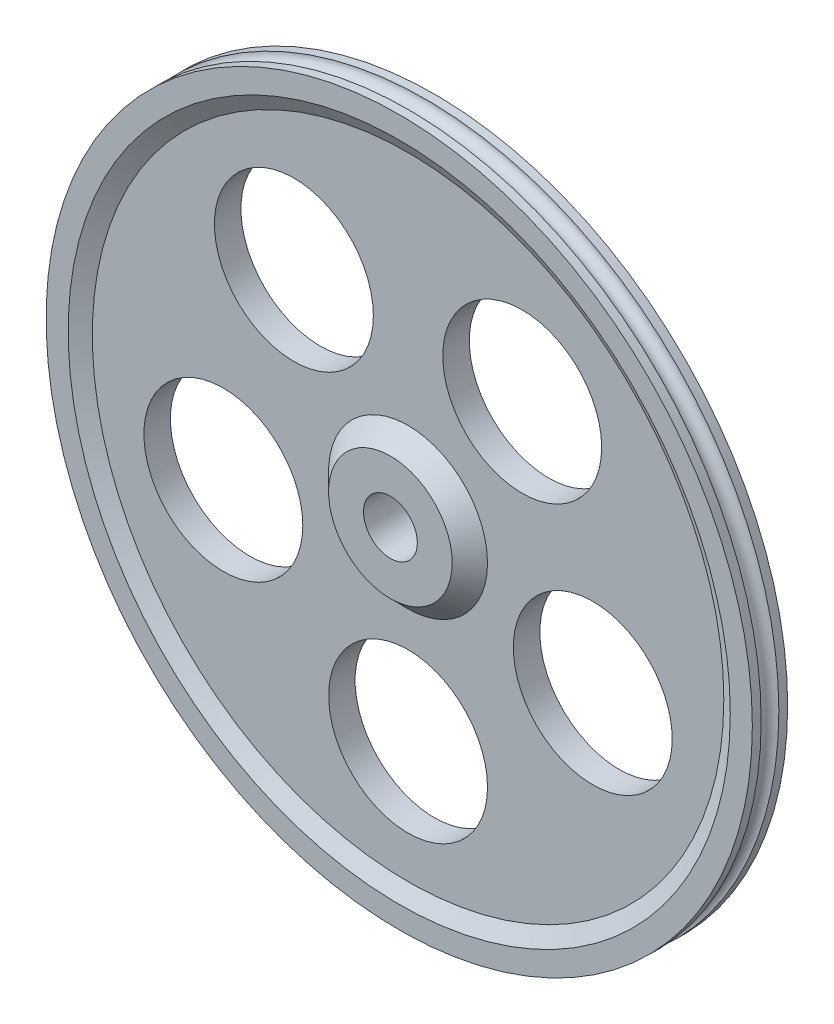
ISO-10303-21;
HEADER;
FILE_DESCRIPTION(('STEP AP214'),'2;1');
FILE_NAME('part.step','',(''),(''),'','','');
FILE_SCHEMA(('AUTOMOTIVE_DESIGN { 1 0 10303 214 1 1 1 1 }'));
ENDSEC;
DATA;
#1=APPLICATION_CONTEXT('core data for automotive mechanical design processes');
#2=APPLICATION_PROTOCOL_DEFINITION('international standard','automotive_design',2000,#1);
#3=PRODUCT_CONTEXT('',#1,'mechanical');
#4=PRODUCT('Part','Part','',(#3));
#5=PRODUCT_RELATED_PRODUCT_CATEGORY('part','',(#4));
#6=PRODUCT_DEFINITION_FORMATION('','',#4);
#7=PRODUCT_DEFINITION_CONTEXT('part definition',#1,'design');
#8=PRODUCT_DEFINITION('design','',#6,#7);
#9=PRODUCT_DEFINITION_SHAPE('','',#8);
#10=(LENGTH_UNIT() NAMED_UNIT(*) SI_UNIT(.MILLI.,.METRE.));
#11=(NAMED_UNIT(*) PLANE_ANGLE_UNIT() SI_UNIT($,.RADIAN.));
#12=(NAMED_UNIT(*) SI_UNIT($,.STERADIAN.) SOLID_ANGLE_UNIT());
#13=UNCERTAINTY_MEASURE_WITH_UNIT(LENGTH_MEASURE(1.E-05),#10,'distance_accuracy_value','');
#14=(GEOMETRIC_REPRESENTATION_CONTEXT(3) GLOBAL_UNCERTAINTY_ASSIGNED_CONTEXT((#13)) GLOBAL_UNIT_ASSIGNED_CONTEXT((#10,
#11,#12)) REPRESENTATION_CONTEXT('',''));
#15=CARTESIAN_POINT('',(0.,0.,0.));
#16=DIRECTION('',(0.,0.,1.));
#17=DIRECTION('',(1.,0.,0.));
#18=AXIS2_PLACEMENT_3D('',#15,#16,#17);
#19=CARTESIAN_POINT('',(0.,0.,3.00000000000001));
#20=DIRECTION('',(0.,0.,1.));
#21=DIRECTION('',(1.,0.,0.));
#22=AXIS2_PLACEMENT_3D('',#19,#20,#21);
#23=PLANE('',#22);
#24=CARTESIAN_POINT('',(0.,0.,3.00000000000001));
#25=DIRECTION('',(0.,0.,1.));
#26=DIRECTION('',(1.,0.,0.));
#27=AXIS2_PLACEMENT_3D('',#24,#25,#26);
#28=CIRCLE('',#27,3.05);
#29=CARTESIAN_POINT('',(3.05,0.,3.00000000000001));
#30=VERTEX_POINT('',#29);
#31=EDGE_CURVE('E66',#30,#30,#28,.T.);
#32=ORIENTED_EDGE('',*,*,#31,.F.);
#33=EDGE_LOOP('',(#32));
#34=FACE_BOUND('',#33,.T.);
#35=CARTESIAN_POINT('',(0.,0.,3.00000000000001));
#36=DIRECTION('',(0.,0.,1.));
#37=DIRECTION('',(1.,0.,0.));
#38=AXIS2_PLACEMENT_3D('',#35,#36,#37);
#39=CIRCLE('',#38,7.);
#40=CARTESIAN_POINT('',(7.,0.,3.00000000000001));
#41=VERTEX_POINT('',#40);
#42=EDGE_CURVE('E40',#41,#41,#39,.T.);
#43=ORIENTED_EDGE('',*,*,#42,.T.);
#44=EDGE_LOOP('',(#43));
#45=FACE_BOUND('',#44,.T.);
#46=ADVANCED_FACE('F33',(#34,#45),#23,.T.);
#47=CARTESIAN_POINT('',(0.,0.,0.999999999999999));
#48=DIRECTION('',(0.,0.,1.));
#49=DIRECTION('',(1.,0.,0.));
#50=AXIS2_PLACEMENT_3D('',#47,#48,#49);
#51=PLANE('',#50);
#52=CARTESIAN_POINT('',(-20.9232433584934,-6.79837387624879,0.999999999999999));
#53=DIRECTION('',(0.,0.,1.));
#54=DIRECTION('',(1.,0.,0.));
#55=AXIS2_PLACEMENT_3D('',#52,#53,#54);
#56=CIRCLE('',#55,9.);
#57=CARTESIAN_POINT('',(-11.9232433584934,-6.79837387624879,0.999999999999999));
#58=VERTEX_POINT('',#57);
#59=EDGE_CURVE('E96',#58,#58,#56,.T.);
#60=ORIENTED_EDGE('',*,*,#59,.F.);
#61=EDGE_LOOP('',(#60));
#62=FACE_BOUND('',#61,.T.);
#63=CARTESIAN_POINT('',(-12.9312755504343,17.7983738762489,0.999999999999999));
#64=DIRECTION('',(0.,0.,1.));
#65=DIRECTION('',(1.,0.,0.));
#66=AXIS2_PLACEMENT_3D('',#63,#64,#65);
#67=CIRCLE('',#66,9.);
#68=CARTESIAN_POINT('',(-3.93127555043431,17.7983738762489,0.999999999999999));
#69=VERTEX_POINT('',#68);
#70=EDGE_CURVE('E90',#69,#69,#67,.T.);
#71=ORIENTED_EDGE('',*,*,#70,.F.);
#72=EDGE_LOOP('',(#71));
#73=FACE_BOUND('',#72,.T.);
#74=CARTESIAN_POINT('',(12.9312755504346,17.7983738762487,0.999999999999999));
#75=DIRECTION('',(0.,0.,1.));
#76=DIRECTION('',(1.,0.,0.));
#77=AXIS2_PLACEMENT_3D('',#74,#75,#76);
#78=CIRCLE('',#77,9.);
#79=CARTESIAN_POINT('',(21.9312755504346,17.7983738762487,0.999999999999999));
#80=VERTEX_POINT('',#79);
#81=EDGE_CURVE('E84',#80,#80,#78,.T.);
#82=ORIENTED_EDGE('',*,*,#81,.F.);
#83=EDGE_LOOP('',(#82));
#84=FACE_BOUND('',#83,.T.);
#85=CARTESIAN_POINT('',(20.9232433584933,-6.79837387624908,0.999999999999999));
#86=DIRECTION('',(0.,0.,1.));
#87=DIRECTION('',(1.,0.,0.));
#88=AXIS2_PLACEMENT_3D('',#85,#86,#87);
#89=CIRCLE('',#88,9.);
#90=CARTESIAN_POINT('',(29.9232433584933,-6.79837387624908,0.999999999999999));
#91=VERTEX_POINT('',#90);
#92=EDGE_CURVE('E78',#91,#91,#89,.T.);
#93=ORIENTED_EDGE('',*,*,#92,.F.);
#94=EDGE_LOOP('',(#93));
#95=FACE_BOUND('',#94,.T.);
#96=CARTESIAN_POINT('',(0.,-22.,0.999999999999999));
#97=DIRECTION('',(0.,0.,1.));
#98=DIRECTION('',(1.,0.,0.));
#99=AXIS2_PLACEMENT_3D('',#96,#97,#98);
#100=CIRCLE('',#99,9.);
#101=CARTESIAN_POINT('',(9.,-22.,0.999999999999999));
#102=VERTEX_POINT('',#101);
#103=EDGE_CURVE('E72',#102,#102,#100,.T.);
#104=ORIENTED_EDGE('',*,*,#103,.F.);
#105=EDGE_LOOP('',(#104));
#106=FACE_BOUND('',#105,.T.);
#107=CARTESIAN_POINT('',(0.,0.,0.999999999999999));
#108=DIRECTION('',(0.,0.,1.));
#109=DIRECTION('',(1.,0.,0.));
#110=AXIS2_PLACEMENT_3D('',#107,#108,#109);
#111=CIRCLE('',#110,8.99999999999997);
#112=CARTESIAN_POINT('',(8.99999999999997,0.,0.999999999999999));
#113=VERTEX_POINT('',#112);
#114=EDGE_CURVE('E10',#113,#113,#111,.F.);
#115=ORIENTED_EDGE('',*,*,#114,.T.);
#116=EDGE_LOOP('',(#115));
#117=FACE_BOUND('',#116,.T.);
#118=CARTESIAN_POINT('',(0.,0.,0.999999999999999));
#119=DIRECTION('',(0.,0.,1.));
#120=DIRECTION('',(1.,0.,0.));
#121=AXIS2_PLACEMENT_3D('',#118,#119,#120);
#122=CIRCLE('',#121,35.7679491924311);
#123=CARTESIAN_POINT('',(35.7679491924311,0.,0.999999999999999));
#124=VERTEX_POINT('',#123);
#125=EDGE_CURVE('E44',#124,#124,#122,.T.);
#126=ORIENTED_EDGE('',*,*,#125,.T.);
#127=EDGE_LOOP('',(#126));
#128=FACE_BOUND('',#127,.T.);
#129=ADVANCED_FACE('F112',(#62,#73,#84,#95,#106,#117,#128),#51,.T.);
#130=CARTESIAN_POINT('',(0.,0.,0.999999999999999));
#131=DIRECTION('',(0.,0.,1.));
#132=DIRECTION('',(1.,0.,0.));
#133=AXIS2_PLACEMENT_3D('',#130,#131,#132);
#134=CONICAL_SURFACE('',#133,35.7679491924311,1.0471975511966);
#135=CARTESIAN_POINT('',(0.,0.,1.99999999999999));
#136=DIRECTION('',(0.,0.,1.));
#137=DIRECTION('',(1.,0.,0.));
#138=AXIS2_PLACEMENT_3D('',#135,#136,#137);
#139=CIRCLE('',#138,37.5);
#140=CARTESIAN_POINT('',(37.5,0.,1.99999999999999));
#141=VERTEX_POINT('',#140);
#142=EDGE_CURVE('E48',#141,#141,#139,.T.);
#143=ORIENTED_EDGE('',*,*,#142,.T.);
#144=EDGE_LOOP('',(#143));
#145=FACE_BOUND('',#144,.T.);
#146=ORIENTED_EDGE('',*,*,#125,.F.);
#147=EDGE_LOOP('',(#146));
#148=FACE_BOUND('',#147,.T.);
#149=ADVANCED_FACE('F115',(#145,#148),#134,.F.);
#150=CARTESIAN_POINT('',(0.,0.,1.99999999999999));
#151=DIRECTION('',(0.,0.,-1.));
#152=DIRECTION('',(-1.,0.,0.));
#153=AXIS2_PLACEMENT_3D('',#150,#151,#152);
#154=PLANE('',#153);
#155=ORIENTED_EDGE('',*,*,#142,.F.);
#156=EDGE_LOOP('',(#155));
#157=FACE_BOUND('',#156,.T.);
#158=CARTESIAN_POINT('',(0.,0.,2.));
#159=DIRECTION('',(0.,0.,1.));
#160=DIRECTION('',(1.,0.,0.));
#161=AXIS2_PLACEMENT_3D('',#158,#159,#160);
#162=CIRCLE('',#161,40.);
#163=CARTESIAN_POINT('',(40.,0.,2.));
#164=VERTEX_POINT('',#163);
#165=EDGE_CURVE('E53',#164,#164,#162,.T.);
#166=ORIENTED_EDGE('',*,*,#165,.T.);
#167=EDGE_LOOP('',(#166));
#168=FACE_BOUND('',#167,.T.);
#169=ADVANCED_FACE('F128',(#157,#168),#154,.F.);
#170=CARTESIAN_POINT('',(0.,0.,2.));
#171=DIRECTION('',(0.,0.,1.));
#172=DIRECTION('',(1.,0.,0.));
#173=AXIS2_PLACEMENT_3D('',#170,#171,#172);
#174=CYLINDRICAL_SURFACE('',#173,40.);
#175=CARTESIAN_POINT('',(0.,0.,0.999999999999998));
#176=DIRECTION('',(0.,0.,1.));
#177=DIRECTION('',(1.,0.,0.));
#178=AXIS2_PLACEMENT_3D('',#175,#176,#177);
#179=CIRCLE('',#178,40.);
#180=CARTESIAN_POINT('',(40.,0.,0.999999999999998));
#181=VERTEX_POINT('',#180);
#182=EDGE_CURVE('E56',#181,#181,#179,.T.);
#183=ORIENTED_EDGE('',*,*,#182,.T.);
#184=EDGE_LOOP('',(#183));
#185=FACE_BOUND('',#184,.T.);
#186=ORIENTED_EDGE('',*,*,#165,.F.);
#187=EDGE_LOOP('',(#186));
#188=FACE_BOUND('',#187,.T.);
#189=ADVANCED_FACE('F134',(#185,#188),#174,.T.);
#190=CARTESIAN_POINT('',(0.,0.,0.));
#191=DIRECTION('',(0.,0.,1.));
#192=DIRECTION('',(1.,0.,0.));
#193=AXIS2_PLACEMENT_3D('',#190,#191,#192);
#194=TOROIDAL_SURFACE('',#193,40.,0.999999999999998);
#195=ORIENTED_EDGE('',*,*,#182,.F.);
#196=EDGE_LOOP('',(#195));
#197=FACE_BOUND('',#196,.T.);
#198=CARTESIAN_POINT('',(0.,0.,-0.999999999999998));
#199=DIRECTION('',(0.,0.,1.));
#200=DIRECTION('',(1.,0.,0.));
#201=AXIS2_PLACEMENT_3D('',#198,#199,#200);
#202=CIRCLE('',#201,40.);
#203=CARTESIAN_POINT('',(40.,0.,-0.999999999999998));
#204=VERTEX_POINT('',#203);
#205=EDGE_CURVE('E59',#204,#204,#202,.T.);
#206=ORIENTED_EDGE('',*,*,#205,.T.);
#207=EDGE_LOOP('',(#206));
#208=FACE_BOUND('',#207,.T.);
#209=ADVANCED_FACE('F161',(#197,#208),#194,.F.);
#210=CARTESIAN_POINT('',(0.,0.,-1.99999999999999));
#211=DIRECTION('',(0.,0.,1.));
#212=DIRECTION('',(1.,0.,0.));
#213=AXIS2_PLACEMENT_3D('',#210,#211,#212);
#214=CIRCLE('',#213,40.);
#215=CARTESIAN_POINT('',(40.,0.,-1.99999999999999));
#216=VERTEX_POINT('',#215);
#217=EDGE_CURVE('E62',#216,#216,#214,.T.);
#218=ORIENTED_EDGE('',*,*,#217,.T.);
#219=EDGE_LOOP('',(#218));
#220=FACE_BOUND('',#219,.T.);
#221=ORIENTED_EDGE('',*,*,#205,.F.);
#222=EDGE_LOOP('',(#221));
#223=FACE_BOUND('',#222,.T.);
#224=ADVANCED_FACE('F153',(#220,#223),#174,.T.);
#225=CARTESIAN_POINT('',(0.,0.,-2.));
#226=DIRECTION('',(0.,0.,-1.));
#227=DIRECTION('',(-1.,0.,0.));
#228=AXIS2_PLACEMENT_3D('',#225,#226,#227);
#229=PLANE('',#228);
#230=CARTESIAN_POINT('',(-20.9232433584934,-6.79837387624879,-1.99999999999999));
#231=DIRECTION('',(0.,0.,1.));
#232=DIRECTION('',(1.,0.,0.));
#233=AXIS2_PLACEMENT_3D('',#230,#231,#232);
#234=CIRCLE('',#233,9.);
#235=CARTESIAN_POINT('',(-11.9232433584934,-6.79837387624879,-1.99999999999999));
#236=VERTEX_POINT('',#235);
#237=EDGE_CURVE('E75',#236,#236,#234,.T.);
#238=ORIENTED_EDGE('',*,*,#237,.T.);
#239=EDGE_LOOP('',(#238));
#240=FACE_BOUND('',#239,.T.);
#241=CARTESIAN_POINT('',(-12.9312755504343,17.7983738762489,-1.99999999999999));
#242=DIRECTION('',(0.,0.,1.));
#243=DIRECTION('',(1.,0.,0.));
#244=AXIS2_PLACEMENT_3D('',#241,#242,#243);
#245=CIRCLE('',#244,9.);
#246=CARTESIAN_POINT('',(-3.93127555043431,17.7983738762489,-1.99999999999999));
#247=VERTEX_POINT('',#246);
#248=EDGE_CURVE('E93',#247,#247,#245,.T.);
#249=ORIENTED_EDGE('',*,*,#248,.T.);
#250=EDGE_LOOP('',(#249));
#251=FACE_BOUND('',#250,.T.);
#252=CARTESIAN_POINT('',(12.9312755504346,17.7983738762487,-1.99999999999999));
#253=DIRECTION('',(0.,0.,1.));
#254=DIRECTION('',(1.,0.,0.));
#255=AXIS2_PLACEMENT_3D('',#252,#253,#254);
#256=CIRCLE('',#255,9.);
#257=CARTESIAN_POINT('',(21.9312755504346,17.7983738762487,-1.99999999999999));
#258=VERTEX_POINT('',#257);
#259=EDGE_CURVE('E87',#258,#258,#256,.T.);
#260=ORIENTED_EDGE('',*,*,#259,.T.);
#261=EDGE_LOOP('',(#260));
#262=FACE_BOUND('',#261,.T.);
#263=CARTESIAN_POINT('',(20.9232433584933,-6.79837387624908,-1.99999999999999));
#264=DIRECTION('',(0.,0.,1.));
#265=DIRECTION('',(1.,0.,0.));
#266=AXIS2_PLACEMENT_3D('',#263,#264,#265);
#267=CIRCLE('',#266,9.);
#268=CARTESIAN_POINT('',(29.9232433584933,-6.79837387624908,-1.99999999999999));
#269=VERTEX_POINT('',#268);
#270=EDGE_CURVE('E81',#269,#269,#267,.T.);
#271=ORIENTED_EDGE('',*,*,#270,.T.);
#272=EDGE_LOOP('',(#271));
#273=FACE_BOUND('',#272,.T.);
#274=CARTESIAN_POINT('',(0.,-22.,-1.99999999999999));
#275=DIRECTION('',(0.,0.,1.));
#276=DIRECTION('',(1.,0.,0.));
#277=AXIS2_PLACEMENT_3D('',#274,#275,#276);
#278=CIRCLE('',#277,9.);
#279=CARTESIAN_POINT('',(9.,-22.,-1.99999999999999));
#280=VERTEX_POINT('',#279);
#281=EDGE_CURVE('E69',#280,#280,#278,.T.);
#282=ORIENTED_EDGE('',*,*,#281,.T.);
#283=EDGE_LOOP('',(#282));
#284=FACE_BOUND('',#283,.T.);
#285=CARTESIAN_POINT('',(0.,0.,-1.99999999999999));
#286=DIRECTION('',(0.,0.,1.));
#287=DIRECTION('',(1.,0.,0.));
#288=AXIS2_PLACEMENT_3D('',#285,#286,#287);
#289=CIRCLE('',#288,3.05);
#290=CARTESIAN_POINT('',(3.05,0.,-1.99999999999999));
#291=VERTEX_POINT('',#290);
#292=EDGE_CURVE('E65',#291,#291,#289,.T.);
#293=ORIENTED_EDGE('',*,*,#292,.T.);
#294=EDGE_LOOP('',(#293));
#295=FACE_BOUND('',#294,.T.);
#296=ORIENTED_EDGE('',*,*,#217,.F.);
#297=EDGE_LOOP('',(#296));
#298=FACE_BOUND('',#297,.T.);
#299=ADVANCED_FACE('F102',(#240,#251,#262,#273,#284,#295,#298),#229,.T.);
#300=CARTESIAN_POINT('',(0.,0.,-1.99999999999999));
#301=DIRECTION('',(0.,0.,1.));
#302=DIRECTION('',(1.,0.,0.));
#303=AXIS2_PLACEMENT_3D('',#300,#301,#302);
#304=CYLINDRICAL_SURFACE('',#303,3.05);
#305=ORIENTED_EDGE('',*,*,#292,.F.);
#306=EDGE_LOOP('',(#305));
#307=FACE_BOUND('',#306,.T.);
#308=ORIENTED_EDGE('',*,*,#31,.T.);
#309=EDGE_LOOP('',(#308));
#310=FACE_BOUND('',#309,.T.);
#311=ADVANCED_FACE('F143',(#307,#310),#304,.F.);
#312=CARTESIAN_POINT('',(0.,0.,2.99999999999999));
#313=DIRECTION('',(0.,0.,-1.));
#314=DIRECTION('',(-1.,0.,0.));
#315=AXIS2_PLACEMENT_3D('',#312,#313,#314);
#316=CONICAL_SURFACE('',#315,7.,0.785398163397442);
#317=ORIENTED_EDGE('',*,*,#114,.F.);
#318=EDGE_LOOP('',(#317));
#319=FACE_BOUND('',#318,.T.);
#320=ORIENTED_EDGE('',*,*,#42,.F.);
#321=EDGE_LOOP('',(#320));
#322=FACE_BOUND('',#321,.T.);
#323=ADVANCED_FACE('F35',(#319,#322),#316,.T.);
#324=CARTESIAN_POINT('',(0.,-22.,-1.99999999999999));
#325=DIRECTION('',(0.,0.,1.));
#326=DIRECTION('',(1.,0.,0.));
#327=AXIS2_PLACEMENT_3D('',#324,#325,#326);
#328=CYLINDRICAL_SURFACE('',#327,9.);
#329=ORIENTED_EDGE('',*,*,#281,.F.);
#330=EDGE_LOOP('',(#329));
#331=FACE_BOUND('',#330,.T.);
#332=ORIENTED_EDGE('',*,*,#103,.T.);
#333=EDGE_LOOP('',(#332));
#334=FACE_BOUND('',#333,.T.);
#335=ADVANCED_FACE('F151',(#331,#334),#328,.F.);
#336=CARTESIAN_POINT('',(20.9232433584933,-6.79837387624908,-1.99999999999999));
#337=DIRECTION('',(0.,0.,1.));
#338=DIRECTION('',(1.,0.,0.));
#339=AXIS2_PLACEMENT_3D('',#336,#337,#338);
#340=CYLINDRICAL_SURFACE('',#339,9.);
#341=ORIENTED_EDGE('',*,*,#270,.F.);
#342=EDGE_LOOP('',(#341));
#343=FACE_BOUND('',#342,.T.);
#344=ORIENTED_EDGE('',*,*,#92,.T.);
#345=EDGE_LOOP('',(#344));
#346=FACE_BOUND('',#345,.T.);
#347=ADVANCED_FACE('F219',(#343,#346),#340,.F.);
#348=CARTESIAN_POINT('',(12.9312755504346,17.7983738762487,-1.99999999999999));
#349=DIRECTION('',(0.,0.,1.));
#350=DIRECTION('',(1.,0.,0.));
#351=AXIS2_PLACEMENT_3D('',#348,#349,#350);
#352=CYLINDRICAL_SURFACE('',#351,9.);
#353=ORIENTED_EDGE('',*,*,#259,.F.);
#354=EDGE_LOOP('',(#353));
#355=FACE_BOUND('',#354,.T.);
#356=ORIENTED_EDGE('',*,*,#81,.T.);
#357=EDGE_LOOP('',(#356));
#358=FACE_BOUND('',#357,.T.);
#359=ADVANCED_FACE('F225',(#355,#358),#352,.F.);
#360=CARTESIAN_POINT('',(-12.9312755504343,17.7983738762489,-1.99999999999999));
#361=DIRECTION('',(0.,0.,1.));
#362=DIRECTION('',(1.,0.,0.));
#363=AXIS2_PLACEMENT_3D('',#360,#361,#362);
#364=CYLINDRICAL_SURFACE('',#363,9.);
#365=ORIENTED_EDGE('',*,*,#248,.F.);
#366=EDGE_LOOP('',(#365));
#367=FACE_BOUND('',#366,.T.);
#368=ORIENTED_EDGE('',*,*,#70,.T.);
#369=EDGE_LOOP('',(#368));
#370=FACE_BOUND('',#369,.T.);
#371=ADVANCED_FACE('F108',(#367,#370),#364,.F.);
#372=CARTESIAN_POINT('',(-20.9232433584934,-6.79837387624879,-1.99999999999999));
#373=DIRECTION('',(0.,0.,1.));
#374=DIRECTION('',(1.,0.,0.));
#375=AXIS2_PLACEMENT_3D('',#372,#373,#374);
#376=CYLINDRICAL_SURFACE('',#375,9.);
#377=ORIENTED_EDGE('',*,*,#237,.F.);
#378=EDGE_LOOP('',(#377));
#379=FACE_BOUND('',#378,.T.);
#380=ORIENTED_EDGE('',*,*,#59,.T.);
#381=EDGE_LOOP('',(#380));
#382=FACE_BOUND('',#381,.T.);
#383=ADVANCED_FACE('F105',(#379,#382),#376,.F.);
#384=CLOSED_SHELL('',(#46,#129,#149,#169,#189,#209,#224,#299,#311,#323,#335,#347,#359,#371,#383));
#385=MANIFOLD_SOLID_BREP('B2',#384);
#386=ADVANCED_BREP_SHAPE_REPRESENTATION('',(#18,#385),#14);
#387=SHAPE_DEFINITION_REPRESENTATION(#9,#386);
ENDSEC;
END-ISO-10303-21;
